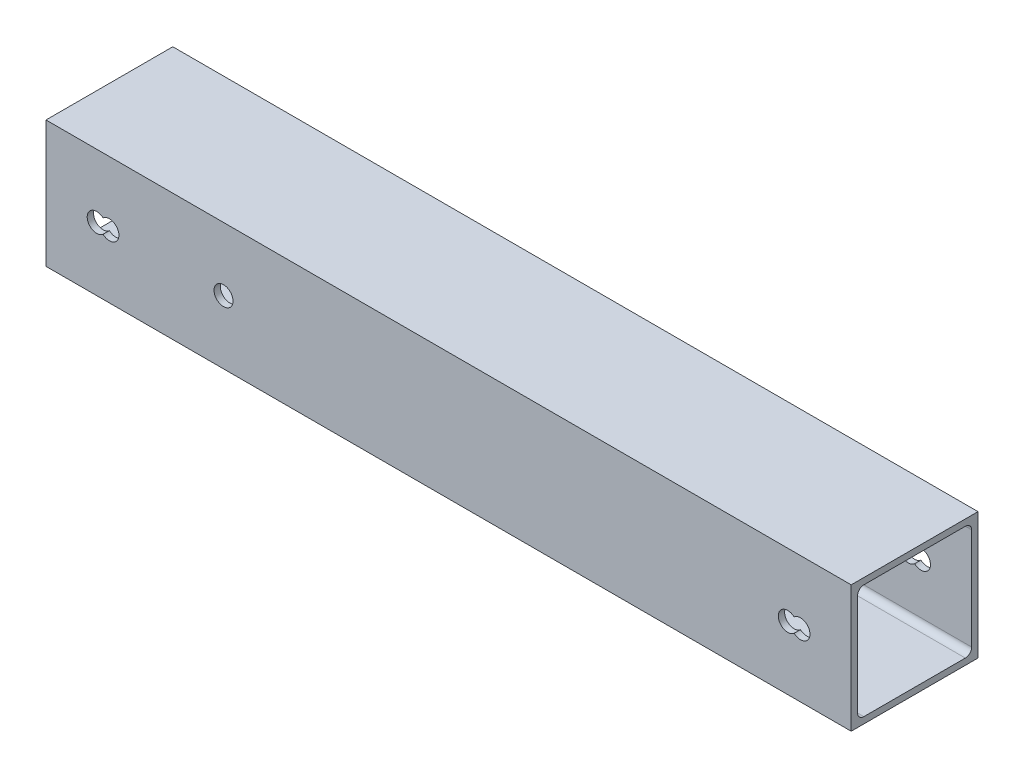
ISO-10303-21;
HEADER;
FILE_DESCRIPTION(('STEP AP214'),'2;1');
FILE_NAME('part.step','',(''),(''),'','','');
FILE_SCHEMA(('AUTOMOTIVE_DESIGN { 1 0 10303 214 1 1 1 1 }'));
ENDSEC;
DATA;
#1=APPLICATION_CONTEXT('core data for automotive mechanical design processes');
#2=APPLICATION_PROTOCOL_DEFINITION('international standard','automotive_design',2000,#1);
#3=PRODUCT_CONTEXT('',#1,'mechanical');
#4=PRODUCT('Part','Part','',(#3));
#5=PRODUCT_RELATED_PRODUCT_CATEGORY('part','',(#4));
#6=PRODUCT_DEFINITION_FORMATION('','',#4);
#7=PRODUCT_DEFINITION_CONTEXT('part definition',#1,'design');
#8=PRODUCT_DEFINITION('design','',#6,#7);
#9=PRODUCT_DEFINITION_SHAPE('','',#8);
#10=(LENGTH_UNIT() NAMED_UNIT(*) SI_UNIT(.MILLI.,.METRE.));
#11=(NAMED_UNIT(*) PLANE_ANGLE_UNIT() SI_UNIT($,.RADIAN.));
#12=(NAMED_UNIT(*) SI_UNIT($,.STERADIAN.) SOLID_ANGLE_UNIT());
#13=UNCERTAINTY_MEASURE_WITH_UNIT(LENGTH_MEASURE(1.E-05),#10,'distance_accuracy_value','');
#14=(GEOMETRIC_REPRESENTATION_CONTEXT(3) GLOBAL_UNCERTAINTY_ASSIGNED_CONTEXT((#13)) GLOBAL_UNIT_ASSIGNED_CONTEXT((#10,
#11,#12)) REPRESENTATION_CONTEXT('',''));
#15=CARTESIAN_POINT('',(0.,0.,0.));
#16=DIRECTION('',(0.,0.,1.));
#17=DIRECTION('',(1.,0.,0.));
#18=AXIS2_PLACEMENT_3D('',#15,#16,#17);
#19=CARTESIAN_POINT('',(127.,0.,0.));
#20=DIRECTION('',(-1.,0.,0.));
#21=DIRECTION('',(0.,0.,1.));
#22=AXIS2_PLACEMENT_3D('',#19,#20,#21);
#23=PLANE('',#22);
#24=DIRECTION('',(0.,1.,0.));
#25=VECTOR('',#24,1.);
#26=CARTESIAN_POINT('',(127.,-10.,-10.));
#27=LINE('',#26,#25);
#28=CARTESIAN_POINT('',(127.,-10.,-10.));
#29=VERTEX_POINT('',#28);
#30=CARTESIAN_POINT('',(127.,10.,-10.));
#31=VERTEX_POINT('',#30);
#32=EDGE_CURVE('E270',#29,#31,#27,.T.);
#33=ORIENTED_EDGE('',*,*,#32,.T.);
#34=DIRECTION('',(0.,0.,1.));
#35=VECTOR('',#34,1.);
#36=CARTESIAN_POINT('',(127.,10.,10.));
#37=LINE('',#36,#35);
#38=CARTESIAN_POINT('',(127.,10.,10.));
#39=VERTEX_POINT('',#38);
#40=EDGE_CURVE('E273',#31,#39,#37,.T.);
#41=ORIENTED_EDGE('',*,*,#40,.T.);
#42=DIRECTION('',(0.,-1.,0.));
#43=VECTOR('',#42,1.);
#44=CARTESIAN_POINT('',(127.,-10.,10.));
#45=LINE('',#44,#43);
#46=CARTESIAN_POINT('',(127.,-10.,10.));
#47=VERTEX_POINT('',#46);
#48=EDGE_CURVE('E276',#39,#47,#45,.T.);
#49=ORIENTED_EDGE('',*,*,#48,.T.);
#50=DIRECTION('',(0.,0.,-1.));
#51=VECTOR('',#50,1.);
#52=CARTESIAN_POINT('',(127.,-10.,10.));
#53=LINE('',#52,#51);
#54=EDGE_CURVE('E278',#47,#29,#53,.T.);
#55=ORIENTED_EDGE('',*,*,#54,.T.);
#56=EDGE_LOOP('',(#33,#41,#49,#55));
#57=FACE_BOUND('',#56,.T.);
#58=CARTESIAN_POINT('',(127.,-8.,8.));
#59=DIRECTION('',(1.,0.,0.));
#60=DIRECTION('',(0.,0.,1.));
#61=AXIS2_PLACEMENT_3D('',#58,#59,#60);
#62=CIRCLE('',#61,1.);
#63=CARTESIAN_POINT('',(127.,-7.99999999999999,9.));
#64=VERTEX_POINT('',#63);
#65=CARTESIAN_POINT('',(127.,-9.,7.99999999999999));
#66=VERTEX_POINT('',#65);
#67=EDGE_CURVE('E211',#64,#66,#62,.T.);
#68=ORIENTED_EDGE('',*,*,#67,.F.);
#69=DIRECTION('',(0.,-1.,0.));
#70=VECTOR('',#69,1.);
#71=CARTESIAN_POINT('',(127.,-7.99999999999999,9.));
#72=LINE('',#71,#70);
#73=CARTESIAN_POINT('',(127.,7.99999999999999,9.));
#74=VERTEX_POINT('',#73);
#75=EDGE_CURVE('E227',#74,#64,#72,.T.);
#76=ORIENTED_EDGE('',*,*,#75,.F.);
#77=CARTESIAN_POINT('',(127.,8.,8.));
#78=DIRECTION('',(1.,0.,0.));
#79=DIRECTION('',(0.,0.,1.));
#80=AXIS2_PLACEMENT_3D('',#77,#78,#79);
#81=CIRCLE('',#80,1.);
#82=CARTESIAN_POINT('',(127.,9.,7.99999999999999));
#83=VERTEX_POINT('',#82);
#84=EDGE_CURVE('E224',#83,#74,#81,.T.);
#85=ORIENTED_EDGE('',*,*,#84,.F.);
#86=DIRECTION('',(0.,0.,1.));
#87=VECTOR('',#86,1.);
#88=CARTESIAN_POINT('',(127.,9.,7.99999999999999));
#89=LINE('',#88,#87);
#90=CARTESIAN_POINT('',(127.,9.,-7.99999999999999));
#91=VERTEX_POINT('',#90);
#92=EDGE_CURVE('E222',#91,#83,#89,.T.);
#93=ORIENTED_EDGE('',*,*,#92,.F.);
#94=CARTESIAN_POINT('',(127.,8.,-8.));
#95=DIRECTION('',(1.,0.,0.));
#96=DIRECTION('',(0.,0.,1.));
#97=AXIS2_PLACEMENT_3D('',#94,#95,#96);
#98=CIRCLE('',#97,1.);
#99=CARTESIAN_POINT('',(127.,7.99999999999999,-9.));
#100=VERTEX_POINT('',#99);
#101=EDGE_CURVE('E220',#100,#91,#98,.T.);
#102=ORIENTED_EDGE('',*,*,#101,.F.);
#103=DIRECTION('',(0.,1.,0.));
#104=VECTOR('',#103,1.);
#105=CARTESIAN_POINT('',(127.,-7.99999999999999,-9.));
#106=LINE('',#105,#104);
#107=CARTESIAN_POINT('',(127.,-8.,-9.));
#108=VERTEX_POINT('',#107);
#109=EDGE_CURVE('E218',#108,#100,#106,.T.);
#110=ORIENTED_EDGE('',*,*,#109,.F.);
#111=CARTESIAN_POINT('',(127.,-8.,-8.));
#112=DIRECTION('',(1.,0.,0.));
#113=DIRECTION('',(0.,0.,-1.));
#114=AXIS2_PLACEMENT_3D('',#111,#112,#113);
#115=CIRCLE('',#114,1.);
#116=CARTESIAN_POINT('',(127.,-9.,-7.99999999999999));
#117=VERTEX_POINT('',#116);
#118=EDGE_CURVE('E216',#117,#108,#115,.T.);
#119=ORIENTED_EDGE('',*,*,#118,.F.);
#120=DIRECTION('',(0.,0.,-1.));
#121=VECTOR('',#120,1.);
#122=CARTESIAN_POINT('',(127.,-9.,7.99999999999999));
#123=LINE('',#122,#121);
#124=EDGE_CURVE('E213',#66,#117,#123,.T.);
#125=ORIENTED_EDGE('',*,*,#124,.F.);
#126=EDGE_LOOP('',(#68,#76,#85,#93,#102,#110,#119,#125));
#127=FACE_BOUND('',#126,.T.);
#128=ADVANCED_FACE('F33',(#57,#127),#23,.F.);
#129=CARTESIAN_POINT('',(0.,0.,0.));
#130=DIRECTION('',(-1.,0.,0.));
#131=DIRECTION('',(0.,0.,1.));
#132=AXIS2_PLACEMENT_3D('',#129,#130,#131);
#133=PLANE('',#132);
#134=DIRECTION('',(0.,1.,0.));
#135=VECTOR('',#134,1.);
#136=CARTESIAN_POINT('',(0.,-10.,-10.));
#137=LINE('',#136,#135);
#138=CARTESIAN_POINT('',(0.,-10.,-10.));
#139=VERTEX_POINT('',#138);
#140=CARTESIAN_POINT('',(0.,10.,-10.));
#141=VERTEX_POINT('',#140);
#142=EDGE_CURVE('E269',#139,#141,#137,.T.);
#143=ORIENTED_EDGE('',*,*,#142,.F.);
#144=DIRECTION('',(0.,0.,-1.));
#145=VECTOR('',#144,1.);
#146=CARTESIAN_POINT('',(0.,-10.,10.));
#147=LINE('',#146,#145);
#148=CARTESIAN_POINT('',(0.,-10.,10.));
#149=VERTEX_POINT('',#148);
#150=EDGE_CURVE('E274',#149,#139,#147,.T.);
#151=ORIENTED_EDGE('',*,*,#150,.F.);
#152=DIRECTION('',(0.,-1.,0.));
#153=VECTOR('',#152,1.);
#154=CARTESIAN_POINT('',(0.,-10.,10.));
#155=LINE('',#154,#153);
#156=CARTESIAN_POINT('',(0.,10.,10.));
#157=VERTEX_POINT('',#156);
#158=EDGE_CURVE('E285',#157,#149,#155,.T.);
#159=ORIENTED_EDGE('',*,*,#158,.F.);
#160=DIRECTION('',(0.,0.,1.));
#161=VECTOR('',#160,1.);
#162=CARTESIAN_POINT('',(0.,10.,10.));
#163=LINE('',#162,#161);
#164=EDGE_CURVE('E283',#141,#157,#163,.T.);
#165=ORIENTED_EDGE('',*,*,#164,.F.);
#166=EDGE_LOOP('',(#143,#151,#159,#165));
#167=FACE_BOUND('',#166,.T.);
#168=DIRECTION('',(0.,-1.,0.));
#169=VECTOR('',#168,1.);
#170=CARTESIAN_POINT('',(0.,-7.99999999999999,9.));
#171=LINE('',#170,#169);
#172=CARTESIAN_POINT('',(0.,7.99999999999999,9.));
#173=VERTEX_POINT('',#172);
#174=CARTESIAN_POINT('',(0.,-7.99999999999999,9.));
#175=VERTEX_POINT('',#174);
#176=EDGE_CURVE('E214',#173,#175,#171,.T.);
#177=ORIENTED_EDGE('',*,*,#176,.T.);
#178=CARTESIAN_POINT('',(0.,-8.,8.));
#179=DIRECTION('',(1.,0.,0.));
#180=DIRECTION('',(0.,0.,1.));
#181=AXIS2_PLACEMENT_3D('',#178,#179,#180);
#182=CIRCLE('',#181,1.);
#183=CARTESIAN_POINT('',(0.,-9.,7.99999999999999));
#184=VERTEX_POINT('',#183);
#185=EDGE_CURVE('E210',#175,#184,#182,.T.);
#186=ORIENTED_EDGE('',*,*,#185,.T.);
#187=DIRECTION('',(0.,0.,-1.));
#188=VECTOR('',#187,1.);
#189=CARTESIAN_POINT('',(0.,-9.,7.99999999999999));
#190=LINE('',#189,#188);
#191=CARTESIAN_POINT('',(0.,-9.,-7.99999999999999));
#192=VERTEX_POINT('',#191);
#193=EDGE_CURVE('E232',#184,#192,#190,.T.);
#194=ORIENTED_EDGE('',*,*,#193,.T.);
#195=CARTESIAN_POINT('',(0.,-8.,-8.));
#196=DIRECTION('',(1.,0.,0.));
#197=DIRECTION('',(0.,0.,-1.));
#198=AXIS2_PLACEMENT_3D('',#195,#196,#197);
#199=CIRCLE('',#198,1.);
#200=CARTESIAN_POINT('',(0.,-8.,-9.));
#201=VERTEX_POINT('',#200);
#202=EDGE_CURVE('E235',#192,#201,#199,.T.);
#203=ORIENTED_EDGE('',*,*,#202,.T.);
#204=DIRECTION('',(0.,1.,0.));
#205=VECTOR('',#204,1.);
#206=CARTESIAN_POINT('',(0.,-7.99999999999999,-9.));
#207=LINE('',#206,#205);
#208=CARTESIAN_POINT('',(0.,7.99999999999999,-9.));
#209=VERTEX_POINT('',#208);
#210=EDGE_CURVE('E238',#201,#209,#207,.T.);
#211=ORIENTED_EDGE('',*,*,#210,.T.);
#212=CARTESIAN_POINT('',(0.,8.,-8.));
#213=DIRECTION('',(1.,0.,0.));
#214=DIRECTION('',(0.,0.,1.));
#215=AXIS2_PLACEMENT_3D('',#212,#213,#214);
#216=CIRCLE('',#215,1.);
#217=CARTESIAN_POINT('',(0.,9.,-7.99999999999999));
#218=VERTEX_POINT('',#217);
#219=EDGE_CURVE('E241',#209,#218,#216,.T.);
#220=ORIENTED_EDGE('',*,*,#219,.T.);
#221=DIRECTION('',(0.,0.,1.));
#222=VECTOR('',#221,1.);
#223=CARTESIAN_POINT('',(0.,9.,7.99999999999999));
#224=LINE('',#223,#222);
#225=CARTESIAN_POINT('',(0.,9.,7.99999999999999));
#226=VERTEX_POINT('',#225);
#227=EDGE_CURVE('E244',#218,#226,#224,.T.);
#228=ORIENTED_EDGE('',*,*,#227,.T.);
#229=CARTESIAN_POINT('',(0.,8.,8.));
#230=DIRECTION('',(1.,0.,0.));
#231=DIRECTION('',(0.,0.,1.));
#232=AXIS2_PLACEMENT_3D('',#229,#230,#231);
#233=CIRCLE('',#232,1.);
#234=EDGE_CURVE('E247',#226,#173,#233,.T.);
#235=ORIENTED_EDGE('',*,*,#234,.T.);
#236=EDGE_LOOP('',(#177,#186,#194,#203,#211,#220,#228,#235));
#237=FACE_BOUND('',#236,.T.);
#238=ADVANCED_FACE('F359',(#167,#237),#133,.T.);
#239=CARTESIAN_POINT('',(127.,-10.,-10.));
#240=DIRECTION('',(0.,0.,1.));
#241=DIRECTION('',(1.,0.,0.));
#242=AXIS2_PLACEMENT_3D('',#239,#240,#241);
#243=PLANE('',#242);
#244=CARTESIAN_POINT('',(28.,0.,-10.));
#245=DIRECTION('',(0.,0.,1.));
#246=DIRECTION('',(1.,0.,0.));
#247=AXIS2_PLACEMENT_3D('',#244,#245,#246);
#248=CIRCLE('',#247,1.5);
#249=CARTESIAN_POINT('',(29.5,0.,-10.));
#250=VERTEX_POINT('',#249);
#251=EDGE_CURVE('E327',#250,#250,#248,.T.);
#252=ORIENTED_EDGE('',*,*,#251,.T.);
#253=EDGE_LOOP('',(#252));
#254=FACE_BOUND('',#253,.T.);
#255=CARTESIAN_POINT('',(117.,0.,-10.));
#256=DIRECTION('',(0.,0.,1.));
#257=DIRECTION('',(1.,0.,0.));
#258=AXIS2_PLACEMENT_3D('',#255,#256,#257);
#259=CIRCLE('',#258,1.5);
#260=CARTESIAN_POINT('',(118.,1.11803398874987,-10.));
#261=VERTEX_POINT('',#260);
#262=CARTESIAN_POINT('',(118.,-1.11803398874987,-10.));
#263=VERTEX_POINT('',#262);
#264=EDGE_CURVE('E188',#261,#263,#259,.T.);
#265=ORIENTED_EDGE('',*,*,#264,.T.);
#266=CARTESIAN_POINT('',(119.,0.,-10.));
#267=DIRECTION('',(0.,0.,1.));
#268=DIRECTION('',(1.,0.,0.));
#269=AXIS2_PLACEMENT_3D('',#266,#267,#268);
#270=CIRCLE('',#269,1.49999999999995);
#271=EDGE_CURVE('E56',#263,#261,#270,.T.);
#272=ORIENTED_EDGE('',*,*,#271,.T.);
#273=EDGE_LOOP('',(#265,#272));
#274=FACE_BOUND('',#273,.T.);
#275=CARTESIAN_POINT('',(10.,0.,-10.));
#276=DIRECTION('',(0.,0.,1.));
#277=DIRECTION('',(1.,0.,0.));
#278=AXIS2_PLACEMENT_3D('',#275,#276,#277);
#279=CIRCLE('',#278,1.5);
#280=CARTESIAN_POINT('',(9.,-1.11803398874989,-10.));
#281=VERTEX_POINT('',#280);
#282=CARTESIAN_POINT('',(9.,1.11803398874989,-10.));
#283=VERTEX_POINT('',#282);
#284=EDGE_CURVE('E201',#281,#283,#279,.T.);
#285=ORIENTED_EDGE('',*,*,#284,.T.);
#286=CARTESIAN_POINT('',(8.,0.,-10.));
#287=DIRECTION('',(0.,0.,1.));
#288=DIRECTION('',(1.,0.,0.));
#289=AXIS2_PLACEMENT_3D('',#286,#287,#288);
#290=CIRCLE('',#289,1.5);
#291=EDGE_CURVE('E334',#283,#281,#290,.T.);
#292=ORIENTED_EDGE('',*,*,#291,.T.);
#293=EDGE_LOOP('',(#285,#292));
#294=FACE_BOUND('',#293,.T.);
#295=ORIENTED_EDGE('',*,*,#142,.T.);
#296=DIRECTION('',(-1.,0.,0.));
#297=VECTOR('',#296,1.);
#298=CARTESIAN_POINT('',(127.,10.,-10.));
#299=LINE('',#298,#297);
#300=EDGE_CURVE('E296',#31,#141,#299,.T.);
#301=ORIENTED_EDGE('',*,*,#300,.F.);
#302=ORIENTED_EDGE('',*,*,#32,.F.);
#303=DIRECTION('',(-1.,0.,0.));
#304=VECTOR('',#303,1.);
#305=CARTESIAN_POINT('',(127.,-10.,-10.));
#306=LINE('',#305,#304);
#307=EDGE_CURVE('E280',#29,#139,#306,.T.);
#308=ORIENTED_EDGE('',*,*,#307,.T.);
#309=EDGE_LOOP('',(#295,#301,#302,#308));
#310=FACE_BOUND('',#309,.T.);
#311=ADVANCED_FACE('F35',(#254,#274,#294,#310),#243,.F.);
#312=CARTESIAN_POINT('',(127.,10.,10.));
#313=DIRECTION('',(0.,-1.,0.));
#314=DIRECTION('',(0.,0.,-1.));
#315=AXIS2_PLACEMENT_3D('',#312,#313,#314);
#316=PLANE('',#315);
#317=ORIENTED_EDGE('',*,*,#164,.T.);
#318=DIRECTION('',(-1.,0.,0.));
#319=VECTOR('',#318,1.);
#320=CARTESIAN_POINT('',(127.,10.,10.));
#321=LINE('',#320,#319);
#322=EDGE_CURVE('E293',#39,#157,#321,.T.);
#323=ORIENTED_EDGE('',*,*,#322,.F.);
#324=ORIENTED_EDGE('',*,*,#40,.F.);
#325=ORIENTED_EDGE('',*,*,#300,.T.);
#326=EDGE_LOOP('',(#317,#323,#324,#325));
#327=FACE_BOUND('',#326,.T.);
#328=ADVANCED_FACE('F416',(#327),#316,.F.);
#329=CARTESIAN_POINT('',(127.,-10.,10.));
#330=DIRECTION('',(0.,0.,-1.));
#331=DIRECTION('',(-1.,0.,0.));
#332=AXIS2_PLACEMENT_3D('',#329,#330,#331);
#333=PLANE('',#332);
#334=CARTESIAN_POINT('',(28.,0.,10.));
#335=DIRECTION('',(0.,0.,1.));
#336=DIRECTION('',(1.,0.,0.));
#337=AXIS2_PLACEMENT_3D('',#334,#335,#336);
#338=CIRCLE('',#337,1.5);
#339=CARTESIAN_POINT('',(29.5,0.,10.));
#340=VERTEX_POINT('',#339);
#341=EDGE_CURVE('E184',#340,#340,#338,.T.);
#342=ORIENTED_EDGE('',*,*,#341,.F.);
#343=EDGE_LOOP('',(#342));
#344=FACE_BOUND('',#343,.T.);
#345=CARTESIAN_POINT('',(117.,0.,10.));
#346=DIRECTION('',(0.,0.,1.));
#347=DIRECTION('',(1.,0.,0.));
#348=AXIS2_PLACEMENT_3D('',#345,#346,#347);
#349=CIRCLE('',#348,1.5);
#350=CARTESIAN_POINT('',(118.,1.11803398874987,10.));
#351=VERTEX_POINT('',#350);
#352=CARTESIAN_POINT('',(118.,-1.11803398874987,10.));
#353=VERTEX_POINT('',#352);
#354=EDGE_CURVE('E181',#351,#353,#349,.T.);
#355=ORIENTED_EDGE('',*,*,#354,.F.);
#356=CARTESIAN_POINT('',(119.,0.,10.));
#357=DIRECTION('',(0.,0.,1.));
#358=DIRECTION('',(1.,0.,0.));
#359=AXIS2_PLACEMENT_3D('',#356,#357,#358);
#360=CIRCLE('',#359,1.49999999999995);
#361=EDGE_CURVE('E168',#353,#351,#360,.T.);
#362=ORIENTED_EDGE('',*,*,#361,.F.);
#363=EDGE_LOOP('',(#355,#362));
#364=FACE_BOUND('',#363,.T.);
#365=CARTESIAN_POINT('',(10.,0.,10.));
#366=DIRECTION('',(0.,0.,1.));
#367=DIRECTION('',(1.,0.,0.));
#368=AXIS2_PLACEMENT_3D('',#365,#366,#367);
#369=CIRCLE('',#368,1.5);
#370=CARTESIAN_POINT('',(9.,-1.11803398874989,10.));
#371=VERTEX_POINT('',#370);
#372=CARTESIAN_POINT('',(9.,1.11803398874989,10.));
#373=VERTEX_POINT('',#372);
#374=EDGE_CURVE('E200',#371,#373,#369,.T.);
#375=ORIENTED_EDGE('',*,*,#374,.F.);
#376=CARTESIAN_POINT('',(8.,0.,10.));
#377=DIRECTION('',(0.,0.,1.));
#378=DIRECTION('',(1.,0.,0.));
#379=AXIS2_PLACEMENT_3D('',#376,#377,#378);
#380=CIRCLE('',#379,1.5);
#381=EDGE_CURVE('E330',#373,#371,#380,.T.);
#382=ORIENTED_EDGE('',*,*,#381,.F.);
#383=EDGE_LOOP('',(#375,#382));
#384=FACE_BOUND('',#383,.T.);
#385=ORIENTED_EDGE('',*,*,#158,.T.);
#386=DIRECTION('',(-1.,0.,0.));
#387=VECTOR('',#386,1.);
#388=CARTESIAN_POINT('',(127.,-10.,10.));
#389=LINE('',#388,#387);
#390=EDGE_CURVE('E290',#47,#149,#389,.T.);
#391=ORIENTED_EDGE('',*,*,#390,.F.);
#392=ORIENTED_EDGE('',*,*,#48,.F.);
#393=ORIENTED_EDGE('',*,*,#322,.T.);
#394=EDGE_LOOP('',(#385,#391,#392,#393));
#395=FACE_BOUND('',#394,.T.);
#396=ADVANCED_FACE('F186',(#344,#364,#384,#395),#333,.F.);
#397=CARTESIAN_POINT('',(127.,-10.,10.));
#398=DIRECTION('',(0.,1.,0.));
#399=DIRECTION('',(0.,0.,1.));
#400=AXIS2_PLACEMENT_3D('',#397,#398,#399);
#401=PLANE('',#400);
#402=ORIENTED_EDGE('',*,*,#150,.T.);
#403=ORIENTED_EDGE('',*,*,#307,.F.);
#404=ORIENTED_EDGE('',*,*,#54,.F.);
#405=ORIENTED_EDGE('',*,*,#390,.T.);
#406=EDGE_LOOP('',(#402,#403,#404,#405));
#407=FACE_BOUND('',#406,.T.);
#408=ADVANCED_FACE('F411',(#407),#401,.F.);
#409=CARTESIAN_POINT('',(127.,-8.,8.));
#410=DIRECTION('',(-1.,0.,0.));
#411=DIRECTION('',(0.,0.,1.));
#412=AXIS2_PLACEMENT_3D('',#409,#410,#411);
#413=CYLINDRICAL_SURFACE('',#412,1.);
#414=ORIENTED_EDGE('',*,*,#185,.F.);
#415=DIRECTION('',(-1.,0.,0.));
#416=VECTOR('',#415,1.);
#417=CARTESIAN_POINT('',(127.,-7.99999999999999,9.));
#418=LINE('',#417,#416);
#419=EDGE_CURVE('E229',#64,#175,#418,.T.);
#420=ORIENTED_EDGE('',*,*,#419,.F.);
#421=ORIENTED_EDGE('',*,*,#67,.T.);
#422=DIRECTION('',(-1.,0.,0.));
#423=VECTOR('',#422,1.);
#424=CARTESIAN_POINT('',(127.,-9.,7.99999999999999));
#425=LINE('',#424,#423);
#426=EDGE_CURVE('E266',#66,#184,#425,.T.);
#427=ORIENTED_EDGE('',*,*,#426,.T.);
#428=EDGE_LOOP('',(#414,#420,#421,#427));
#429=FACE_BOUND('',#428,.T.);
#430=ADVANCED_FACE('F370',(#429),#413,.F.);
#431=CARTESIAN_POINT('',(127.,-9.,7.99999999999999));
#432=DIRECTION('',(0.,1.,0.));
#433=DIRECTION('',(0.,0.,1.));
#434=AXIS2_PLACEMENT_3D('',#431,#432,#433);
#435=PLANE('',#434);
#436=ORIENTED_EDGE('',*,*,#193,.F.);
#437=ORIENTED_EDGE('',*,*,#426,.F.);
#438=ORIENTED_EDGE('',*,*,#124,.T.);
#439=DIRECTION('',(-1.,0.,0.));
#440=VECTOR('',#439,1.);
#441=CARTESIAN_POINT('',(127.,-9.,-7.99999999999999));
#442=LINE('',#441,#440);
#443=EDGE_CURVE('E264',#117,#192,#442,.T.);
#444=ORIENTED_EDGE('',*,*,#443,.T.);
#445=EDGE_LOOP('',(#436,#437,#438,#444));
#446=FACE_BOUND('',#445,.T.);
#447=ADVANCED_FACE('F374',(#446),#435,.T.);
#448=CARTESIAN_POINT('',(127.,-8.,-8.));
#449=DIRECTION('',(-1.,0.,0.));
#450=DIRECTION('',(0.,0.,1.));
#451=AXIS2_PLACEMENT_3D('',#448,#449,#450);
#452=CYLINDRICAL_SURFACE('',#451,1.);
#453=ORIENTED_EDGE('',*,*,#202,.F.);
#454=ORIENTED_EDGE('',*,*,#443,.F.);
#455=ORIENTED_EDGE('',*,*,#118,.T.);
#456=DIRECTION('',(-1.,0.,0.));
#457=VECTOR('',#456,1.);
#458=CARTESIAN_POINT('',(127.,-8.,-9.));
#459=LINE('',#458,#457);
#460=EDGE_CURVE('E262',#108,#201,#459,.T.);
#461=ORIENTED_EDGE('',*,*,#460,.T.);
#462=EDGE_LOOP('',(#453,#454,#455,#461));
#463=FACE_BOUND('',#462,.T.);
#464=ADVANCED_FACE('F378',(#463),#452,.F.);
#465=CARTESIAN_POINT('',(127.,-7.99999999999999,-9.));
#466=DIRECTION('',(0.,0.,1.));
#467=DIRECTION('',(0.,-1.,0.));
#468=AXIS2_PLACEMENT_3D('',#465,#466,#467);
#469=PLANE('',#468);
#470=CARTESIAN_POINT('',(119.,0.,-9.));
#471=DIRECTION('',(0.,0.,1.));
#472=DIRECTION('',(0.,-1.,0.));
#473=AXIS2_PLACEMENT_3D('',#470,#471,#472);
#474=CIRCLE('',#473,1.49999999999995);
#475=CARTESIAN_POINT('',(118.,-1.11803398874987,-9.));
#476=VERTEX_POINT('',#475);
#477=CARTESIAN_POINT('',(118.,1.11803398874987,-9.));
#478=VERTEX_POINT('',#477);
#479=EDGE_CURVE('E176',#476,#478,#474,.T.);
#480=ORIENTED_EDGE('',*,*,#479,.F.);
#481=CARTESIAN_POINT('',(117.,0.,-9.));
#482=DIRECTION('',(0.,0.,1.));
#483=DIRECTION('',(0.,-1.,0.));
#484=AXIS2_PLACEMENT_3D('',#481,#482,#483);
#485=CIRCLE('',#484,1.5);
#486=EDGE_CURVE('E197',#478,#476,#485,.T.);
#487=ORIENTED_EDGE('',*,*,#486,.F.);
#488=EDGE_LOOP('',(#480,#487));
#489=FACE_BOUND('',#488,.T.);
#490=CARTESIAN_POINT('',(28.,0.,-9.00000000000001));
#491=DIRECTION('',(0.,0.,1.));
#492=DIRECTION('',(0.,-1.,0.));
#493=AXIS2_PLACEMENT_3D('',#490,#491,#492);
#494=CIRCLE('',#493,1.5);
#495=CARTESIAN_POINT('',(28.,-1.5,-9.00000000000001));
#496=VERTEX_POINT('',#495);
#497=EDGE_CURVE('E310',#496,#496,#494,.T.);
#498=ORIENTED_EDGE('',*,*,#497,.F.);
#499=EDGE_LOOP('',(#498));
#500=FACE_BOUND('',#499,.T.);
#501=CARTESIAN_POINT('',(8.,0.,-9.00000000000001));
#502=DIRECTION('',(0.,0.,1.));
#503=DIRECTION('',(0.,-1.,0.));
#504=AXIS2_PLACEMENT_3D('',#501,#502,#503);
#505=CIRCLE('',#504,1.5);
#506=CARTESIAN_POINT('',(9.,1.11803398874989,-9.00000000000001));
#507=VERTEX_POINT('',#506);
#508=CARTESIAN_POINT('',(9.,-1.11803398874989,-9.00000000000001));
#509=VERTEX_POINT('',#508);
#510=EDGE_CURVE('E332',#507,#509,#505,.T.);
#511=ORIENTED_EDGE('',*,*,#510,.F.);
#512=CARTESIAN_POINT('',(10.,0.,-9.));
#513=DIRECTION('',(0.,0.,1.));
#514=DIRECTION('',(0.,-1.,0.));
#515=AXIS2_PLACEMENT_3D('',#512,#513,#514);
#516=CIRCLE('',#515,1.5);
#517=EDGE_CURVE('E207',#509,#507,#516,.T.);
#518=ORIENTED_EDGE('',*,*,#517,.F.);
#519=EDGE_LOOP('',(#511,#518));
#520=FACE_BOUND('',#519,.T.);
#521=ORIENTED_EDGE('',*,*,#210,.F.);
#522=ORIENTED_EDGE('',*,*,#460,.F.);
#523=ORIENTED_EDGE('',*,*,#109,.T.);
#524=DIRECTION('',(-1.,0.,0.));
#525=VECTOR('',#524,1.);
#526=CARTESIAN_POINT('',(127.,7.99999999999999,-9.));
#527=LINE('',#526,#525);
#528=EDGE_CURVE('E260',#100,#209,#527,.T.);
#529=ORIENTED_EDGE('',*,*,#528,.T.);
#530=EDGE_LOOP('',(#521,#522,#523,#529));
#531=FACE_BOUND('',#530,.T.);
#532=ADVANCED_FACE('F383',(#489,#500,#520,#531),#469,.T.);
#533=CARTESIAN_POINT('',(127.,8.,-8.));
#534=DIRECTION('',(-1.,0.,0.));
#535=DIRECTION('',(0.,0.,1.));
#536=AXIS2_PLACEMENT_3D('',#533,#534,#535);
#537=CYLINDRICAL_SURFACE('',#536,1.);
#538=ORIENTED_EDGE('',*,*,#219,.F.);
#539=ORIENTED_EDGE('',*,*,#528,.F.);
#540=ORIENTED_EDGE('',*,*,#101,.T.);
#541=DIRECTION('',(-1.,0.,0.));
#542=VECTOR('',#541,1.);
#543=CARTESIAN_POINT('',(127.,9.,-7.99999999999999));
#544=LINE('',#543,#542);
#545=EDGE_CURVE('E258',#91,#218,#544,.T.);
#546=ORIENTED_EDGE('',*,*,#545,.T.);
#547=EDGE_LOOP('',(#538,#539,#540,#546));
#548=FACE_BOUND('',#547,.T.);
#549=ADVANCED_FACE('F387',(#548),#537,.F.);
#550=CARTESIAN_POINT('',(127.,9.,7.99999999999999));
#551=DIRECTION('',(0.,-1.,0.));
#552=DIRECTION('',(0.,0.,-1.));
#553=AXIS2_PLACEMENT_3D('',#550,#551,#552);
#554=PLANE('',#553);
#555=ORIENTED_EDGE('',*,*,#227,.F.);
#556=ORIENTED_EDGE('',*,*,#545,.F.);
#557=ORIENTED_EDGE('',*,*,#92,.T.);
#558=DIRECTION('',(-1.,0.,0.));
#559=VECTOR('',#558,1.);
#560=CARTESIAN_POINT('',(127.,9.,7.99999999999999));
#561=LINE('',#560,#559);
#562=EDGE_CURVE('E256',#83,#226,#561,.T.);
#563=ORIENTED_EDGE('',*,*,#562,.T.);
#564=EDGE_LOOP('',(#555,#556,#557,#563));
#565=FACE_BOUND('',#564,.T.);
#566=ADVANCED_FACE('F391',(#565),#554,.T.);
#567=CARTESIAN_POINT('',(127.,8.,8.));
#568=DIRECTION('',(-1.,0.,0.));
#569=DIRECTION('',(0.,0.,1.));
#570=AXIS2_PLACEMENT_3D('',#567,#568,#569);
#571=CYLINDRICAL_SURFACE('',#570,1.);
#572=ORIENTED_EDGE('',*,*,#234,.F.);
#573=ORIENTED_EDGE('',*,*,#562,.F.);
#574=ORIENTED_EDGE('',*,*,#84,.T.);
#575=DIRECTION('',(-1.,0.,0.));
#576=VECTOR('',#575,1.);
#577=CARTESIAN_POINT('',(127.,7.99999999999999,9.));
#578=LINE('',#577,#576);
#579=EDGE_CURVE('E254',#74,#173,#578,.T.);
#580=ORIENTED_EDGE('',*,*,#579,.T.);
#581=EDGE_LOOP('',(#572,#573,#574,#580));
#582=FACE_BOUND('',#581,.T.);
#583=ADVANCED_FACE('F352',(#582),#571,.F.);
#584=CARTESIAN_POINT('',(127.,-7.99999999999999,9.));
#585=DIRECTION('',(0.,0.,-1.));
#586=DIRECTION('',(-1.,0.,0.));
#587=AXIS2_PLACEMENT_3D('',#584,#585,#586);
#588=PLANE('',#587);
#589=CARTESIAN_POINT('',(119.,0.,9.));
#590=DIRECTION('',(0.,0.,-1.));
#591=DIRECTION('',(-1.,0.,0.));
#592=AXIS2_PLACEMENT_3D('',#589,#590,#591);
#593=CIRCLE('',#592,1.49999999999995);
#594=CARTESIAN_POINT('',(118.,1.11803398874987,9.));
#595=VERTEX_POINT('',#594);
#596=CARTESIAN_POINT('',(118.,-1.11803398874987,9.));
#597=VERTEX_POINT('',#596);
#598=EDGE_CURVE('E48',#595,#597,#593,.T.);
#599=ORIENTED_EDGE('',*,*,#598,.F.);
#600=CARTESIAN_POINT('',(117.,0.,9.));
#601=DIRECTION('',(0.,0.,-1.));
#602=DIRECTION('',(-1.,0.,0.));
#603=AXIS2_PLACEMENT_3D('',#600,#601,#602);
#604=CIRCLE('',#603,1.5);
#605=EDGE_CURVE('E183',#597,#595,#604,.T.);
#606=ORIENTED_EDGE('',*,*,#605,.F.);
#607=EDGE_LOOP('',(#599,#606));
#608=FACE_BOUND('',#607,.T.);
#609=CARTESIAN_POINT('',(28.,0.,9.00000000000001));
#610=DIRECTION('',(0.,0.,-1.));
#611=DIRECTION('',(-1.,0.,0.));
#612=AXIS2_PLACEMENT_3D('',#609,#610,#611);
#613=CIRCLE('',#612,1.5);
#614=CARTESIAN_POINT('',(26.5,0.,9.00000000000001));
#615=VERTEX_POINT('',#614);
#616=EDGE_CURVE('E308',#615,#615,#613,.T.);
#617=ORIENTED_EDGE('',*,*,#616,.F.);
#618=EDGE_LOOP('',(#617));
#619=FACE_BOUND('',#618,.T.);
#620=CARTESIAN_POINT('',(8.,0.,9.00000000000001));
#621=DIRECTION('',(0.,0.,-1.));
#622=DIRECTION('',(-1.,0.,0.));
#623=AXIS2_PLACEMENT_3D('',#620,#621,#622);
#624=CIRCLE('',#623,1.5);
#625=CARTESIAN_POINT('',(9.,-1.11803398874989,9.00000000000001));
#626=VERTEX_POINT('',#625);
#627=CARTESIAN_POINT('',(9.,1.11803398874989,9.));
#628=VERTEX_POINT('',#627);
#629=EDGE_CURVE('E194',#626,#628,#624,.T.);
#630=ORIENTED_EDGE('',*,*,#629,.F.);
#631=CARTESIAN_POINT('',(10.,0.,9.));
#632=DIRECTION('',(0.,0.,-1.));
#633=DIRECTION('',(-1.,0.,0.));
#634=AXIS2_PLACEMENT_3D('',#631,#632,#633);
#635=CIRCLE('',#634,1.5);
#636=EDGE_CURVE('E204',#628,#626,#635,.T.);
#637=ORIENTED_EDGE('',*,*,#636,.F.);
#638=EDGE_LOOP('',(#630,#637));
#639=FACE_BOUND('',#638,.T.);
#640=ORIENTED_EDGE('',*,*,#176,.F.);
#641=ORIENTED_EDGE('',*,*,#579,.F.);
#642=ORIENTED_EDGE('',*,*,#75,.T.);
#643=ORIENTED_EDGE('',*,*,#419,.T.);
#644=EDGE_LOOP('',(#640,#641,#642,#643));
#645=FACE_BOUND('',#644,.T.);
#646=ADVANCED_FACE('F349',(#608,#619,#639,#645),#588,.T.);
#647=CARTESIAN_POINT('',(10.,0.,-10.));
#648=DIRECTION('',(0.,0.,1.));
#649=DIRECTION('',(1.,0.,0.));
#650=AXIS2_PLACEMENT_3D('',#647,#648,#649);
#651=CYLINDRICAL_SURFACE('',#650,1.5);
#652=ORIENTED_EDGE('',*,*,#636,.T.);
#653=DIRECTION('',(0.,0.,1.));
#654=VECTOR('',#653,1.);
#655=CARTESIAN_POINT('',(9.,-1.11803398874989,-290.));
#656=LINE('',#655,#654);
#657=EDGE_CURVE('E189',#626,#371,#656,.T.);
#658=ORIENTED_EDGE('',*,*,#657,.T.);
#659=ORIENTED_EDGE('',*,*,#374,.T.);
#660=DIRECTION('',(0.,0.,1.));
#661=VECTOR('',#660,1.);
#662=CARTESIAN_POINT('',(9.,1.11803398874989,-290.));
#663=LINE('',#662,#661);
#664=EDGE_CURVE('E337',#373,#628,#663,.F.);
#665=ORIENTED_EDGE('',*,*,#664,.T.);
#666=EDGE_LOOP('',(#652,#658,#659,#665));
#667=FACE_BOUND('',#666,.T.);
#668=ADVANCED_FACE('F347',(#667),#651,.F.);
#669=ORIENTED_EDGE('',*,*,#284,.F.);
#670=DIRECTION('',(0.,0.,1.));
#671=VECTOR('',#670,1.);
#672=CARTESIAN_POINT('',(9.,-1.11803398874989,-290.));
#673=LINE('',#672,#671);
#674=EDGE_CURVE('E305',#281,#509,#673,.T.);
#675=ORIENTED_EDGE('',*,*,#674,.T.);
#676=ORIENTED_EDGE('',*,*,#517,.T.);
#677=DIRECTION('',(0.,0.,1.));
#678=VECTOR('',#677,1.);
#679=CARTESIAN_POINT('',(9.,1.11803398874989,-290.));
#680=LINE('',#679,#678);
#681=EDGE_CURVE('E299',#507,#283,#680,.F.);
#682=ORIENTED_EDGE('',*,*,#681,.T.);
#683=EDGE_LOOP('',(#669,#675,#676,#682));
#684=FACE_BOUND('',#683,.T.);
#685=ADVANCED_FACE('F458',(#684),#651,.F.);
#686=CARTESIAN_POINT('',(117.,0.,-10.));
#687=DIRECTION('',(0.,0.,1.));
#688=DIRECTION('',(1.,0.,0.));
#689=AXIS2_PLACEMENT_3D('',#686,#687,#688);
#690=CYLINDRICAL_SURFACE('',#689,1.5);
#691=ORIENTED_EDGE('',*,*,#605,.T.);
#692=DIRECTION('',(0.,0.,1.));
#693=VECTOR('',#692,1.);
#694=CARTESIAN_POINT('',(118.,1.11803398874987,-5.));
#695=LINE('',#694,#693);
#696=EDGE_CURVE('E171',#595,#351,#695,.T.);
#697=ORIENTED_EDGE('',*,*,#696,.T.);
#698=ORIENTED_EDGE('',*,*,#354,.T.);
#699=DIRECTION('',(0.,0.,1.));
#700=VECTOR('',#699,1.);
#701=CARTESIAN_POINT('',(118.,-1.11803398874987,-5.));
#702=LINE('',#701,#700);
#703=EDGE_CURVE('E172',#353,#597,#702,.F.);
#704=ORIENTED_EDGE('',*,*,#703,.T.);
#705=EDGE_LOOP('',(#691,#697,#698,#704));
#706=FACE_BOUND('',#705,.T.);
#707=ADVANCED_FACE('F180',(#706),#690,.F.);
#708=ORIENTED_EDGE('',*,*,#264,.F.);
#709=DIRECTION('',(0.,0.,1.));
#710=VECTOR('',#709,1.);
#711=CARTESIAN_POINT('',(118.,1.11803398874987,-5.));
#712=LINE('',#711,#710);
#713=EDGE_CURVE('E11',#261,#478,#712,.T.);
#714=ORIENTED_EDGE('',*,*,#713,.T.);
#715=ORIENTED_EDGE('',*,*,#486,.T.);
#716=DIRECTION('',(0.,0.,1.));
#717=VECTOR('',#716,1.);
#718=CARTESIAN_POINT('',(118.,-1.11803398874987,-5.));
#719=LINE('',#718,#717);
#720=EDGE_CURVE('E41',#476,#263,#719,.F.);
#721=ORIENTED_EDGE('',*,*,#720,.T.);
#722=EDGE_LOOP('',(#708,#714,#715,#721));
#723=FACE_BOUND('',#722,.T.);
#724=ADVANCED_FACE('F313',(#723),#690,.F.);
#725=CARTESIAN_POINT('',(8.,0.,-590.));
#726=DIRECTION('',(0.,0.,1.));
#727=DIRECTION('',(1.,0.,0.));
#728=AXIS2_PLACEMENT_3D('',#725,#726,#727);
#729=CYLINDRICAL_SURFACE('',#728,1.5);
#730=ORIENTED_EDGE('',*,*,#291,.F.);
#731=ORIENTED_EDGE('',*,*,#681,.F.);
#732=ORIENTED_EDGE('',*,*,#510,.T.);
#733=ORIENTED_EDGE('',*,*,#674,.F.);
#734=EDGE_LOOP('',(#730,#731,#732,#733));
#735=FACE_BOUND('',#734,.T.);
#736=ADVANCED_FACE('F455',(#735),#729,.F.);
#737=ORIENTED_EDGE('',*,*,#629,.T.);
#738=ORIENTED_EDGE('',*,*,#664,.F.);
#739=ORIENTED_EDGE('',*,*,#381,.T.);
#740=ORIENTED_EDGE('',*,*,#657,.F.);
#741=EDGE_LOOP('',(#737,#738,#739,#740));
#742=FACE_BOUND('',#741,.T.);
#743=ADVANCED_FACE('F342',(#742),#729,.F.);
#744=CARTESIAN_POINT('',(28.,0.,-590.));
#745=DIRECTION('',(0.,0.,1.));
#746=DIRECTION('',(1.,0.,0.));
#747=AXIS2_PLACEMENT_3D('',#744,#745,#746);
#748=CYLINDRICAL_SURFACE('',#747,1.5);
#749=ORIENTED_EDGE('',*,*,#616,.T.);
#750=EDGE_LOOP('',(#749));
#751=FACE_BOUND('',#750,.T.);
#752=ORIENTED_EDGE('',*,*,#341,.T.);
#753=EDGE_LOOP('',(#752));
#754=FACE_BOUND('',#753,.T.);
#755=ADVANCED_FACE('F443',(#751,#754),#748,.F.);
#756=ORIENTED_EDGE('',*,*,#497,.T.);
#757=EDGE_LOOP('',(#756));
#758=FACE_BOUND('',#757,.T.);
#759=ORIENTED_EDGE('',*,*,#251,.F.);
#760=EDGE_LOOP('',(#759));
#761=FACE_BOUND('',#760,.T.);
#762=ADVANCED_FACE('F440',(#758,#761),#748,.F.);
#763=CARTESIAN_POINT('',(119.,0.,-20.));
#764=DIRECTION('',(0.,0.,1.));
#765=DIRECTION('',(1.,0.,0.));
#766=AXIS2_PLACEMENT_3D('',#763,#764,#765);
#767=CYLINDRICAL_SURFACE('',#766,1.49999999999995);
#768=ORIENTED_EDGE('',*,*,#271,.F.);
#769=ORIENTED_EDGE('',*,*,#720,.F.);
#770=ORIENTED_EDGE('',*,*,#479,.T.);
#771=ORIENTED_EDGE('',*,*,#713,.F.);
#772=EDGE_LOOP('',(#768,#769,#770,#771));
#773=FACE_BOUND('',#772,.T.);
#774=ADVANCED_FACE('F442',(#773),#767,.F.);
#775=ORIENTED_EDGE('',*,*,#598,.T.);
#776=ORIENTED_EDGE('',*,*,#703,.F.);
#777=ORIENTED_EDGE('',*,*,#361,.T.);
#778=ORIENTED_EDGE('',*,*,#696,.F.);
#779=EDGE_LOOP('',(#775,#776,#777,#778));
#780=FACE_BOUND('',#779,.T.);
#781=ADVANCED_FACE('F170',(#780),#767,.F.);
#782=CLOSED_SHELL('',(#128,#238,#311,#328,#396,#408,#430,#447,#464,#532,#549,#566,#583,#646,
#668,#685,#707,#724,#736,#743,#755,#762,#774,#781));
#783=MANIFOLD_SOLID_BREP('B2',#782);
#784=ADVANCED_BREP_SHAPE_REPRESENTATION('',(#18,#783),#14);
#785=SHAPE_DEFINITION_REPRESENTATION(#9,#784);
ENDSEC;
END-ISO-10303-21;
